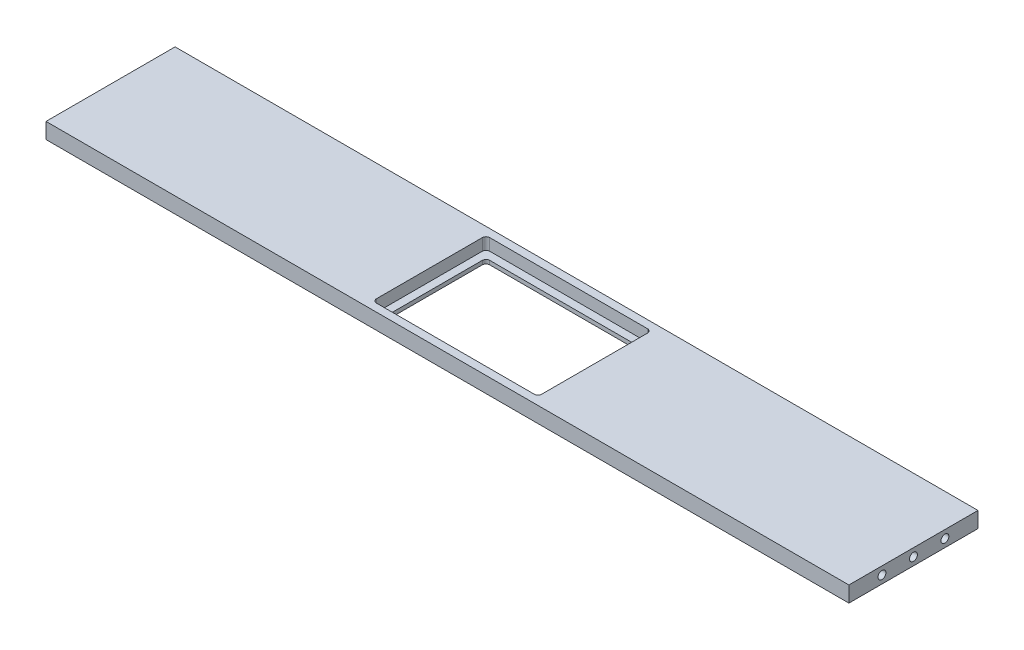
ISO-10303-21;
HEADER;
FILE_DESCRIPTION(('STEP AP214'),'2;1');
FILE_NAME('part.step','',(''),(''),'','','');
FILE_SCHEMA(('AUTOMOTIVE_DESIGN { 1 0 10303 214 1 1 1 1 }'));
ENDSEC;
DATA;
#1=APPLICATION_CONTEXT('core data for automotive mechanical design processes');
#2=APPLICATION_PROTOCOL_DEFINITION('international standard','automotive_design',2000,#1);
#3=PRODUCT_CONTEXT('',#1,'mechanical');
#4=PRODUCT('Part','Part','',(#3));
#5=PRODUCT_RELATED_PRODUCT_CATEGORY('part','',(#4));
#6=PRODUCT_DEFINITION_FORMATION('','',#4);
#7=PRODUCT_DEFINITION_CONTEXT('part definition',#1,'design');
#8=PRODUCT_DEFINITION('design','',#6,#7);
#9=PRODUCT_DEFINITION_SHAPE('','',#8);
#10=(LENGTH_UNIT() NAMED_UNIT(*) SI_UNIT(.MILLI.,.METRE.));
#11=(NAMED_UNIT(*) PLANE_ANGLE_UNIT() SI_UNIT($,.RADIAN.));
#12=(NAMED_UNIT(*) SI_UNIT($,.STERADIAN.) SOLID_ANGLE_UNIT());
#13=UNCERTAINTY_MEASURE_WITH_UNIT(LENGTH_MEASURE(1.E-05),#10,'distance_accuracy_value','');
#14=(GEOMETRIC_REPRESENTATION_CONTEXT(3) GLOBAL_UNCERTAINTY_ASSIGNED_CONTEXT((#13)) GLOBAL_UNIT_ASSIGNED_CONTEXT((#10,
#11,#12)) REPRESENTATION_CONTEXT('',''));
#15=CARTESIAN_POINT('',(0.,0.,0.));
#16=DIRECTION('',(0.,0.,1.));
#17=DIRECTION('',(1.,0.,0.));
#18=AXIS2_PLACEMENT_3D('',#15,#16,#17);
#19=CARTESIAN_POINT('',(-323.85,-12.7,52.07));
#20=DIRECTION('',(0.,1.,0.));
#21=DIRECTION('',(0.,0.,1.));
#22=AXIS2_PLACEMENT_3D('',#19,#20,#21);
#23=PLANE('',#22);
#24=DIRECTION('',(1.,0.,0.));
#25=VECTOR('',#24,1.);
#26=CARTESIAN_POINT('',(-323.85,-12.7,-52.07));
#27=LINE('',#26,#25);
#28=CARTESIAN_POINT('',(-323.85,-12.7,-52.07));
#29=VERTEX_POINT('',#28);
#30=CARTESIAN_POINT('',(323.85,-12.7,-52.07));
#31=VERTEX_POINT('',#30);
#32=EDGE_CURVE('E296',#29,#31,#27,.T.);
#33=ORIENTED_EDGE('',*,*,#32,.T.);
#34=DIRECTION('',(0.,0.,-1.));
#35=VECTOR('',#34,1.);
#36=CARTESIAN_POINT('',(323.85,-12.7,52.07));
#37=LINE('',#36,#35);
#38=CARTESIAN_POINT('',(323.85,-12.7,52.07));
#39=VERTEX_POINT('',#38);
#40=EDGE_CURVE('E365',#39,#31,#37,.T.);
#41=ORIENTED_EDGE('',*,*,#40,.F.);
#42=DIRECTION('',(1.,0.,0.));
#43=VECTOR('',#42,1.);
#44=CARTESIAN_POINT('',(-323.85,-12.7,52.07));
#45=LINE('',#44,#43);
#46=CARTESIAN_POINT('',(-323.85,-12.7,52.07));
#47=VERTEX_POINT('',#46);
#48=EDGE_CURVE('E339',#47,#39,#45,.T.);
#49=ORIENTED_EDGE('',*,*,#48,.F.);
#50=DIRECTION('',(0.,0.,-1.));
#51=VECTOR('',#50,1.);
#52=CARTESIAN_POINT('',(-323.85,-12.7,52.07));
#53=LINE('',#52,#51);
#54=EDGE_CURVE('E349',#47,#29,#53,.T.);
#55=ORIENTED_EDGE('',*,*,#54,.T.);
#56=EDGE_LOOP('',(#33,#41,#49,#55));
#57=FACE_BOUND('',#56,.T.);
#58=CARTESIAN_POINT('',(57.325,-12.7,36.37));
#59=DIRECTION('',(0.,-1.,0.));
#60=DIRECTION('',(0.,0.,-1.));
#61=AXIS2_PLACEMENT_3D('',#58,#59,#60);
#62=CIRCLE('',#61,3.);
#63=CARTESIAN_POINT('',(60.325,-12.7,36.37));
#64=VERTEX_POINT('',#63);
#65=CARTESIAN_POINT('',(57.325,-12.7,39.37));
#66=VERTEX_POINT('',#65);
#67=EDGE_CURVE('E190',#64,#66,#62,.T.);
#68=ORIENTED_EDGE('',*,*,#67,.F.);
#69=DIRECTION('',(0.,0.,1.));
#70=VECTOR('',#69,1.);
#71=CARTESIAN_POINT('',(60.325,-12.7,-36.37));
#72=LINE('',#71,#70);
#73=CARTESIAN_POINT('',(60.325,-12.7,-36.37));
#74=VERTEX_POINT('',#73);
#75=EDGE_CURVE('E223',#74,#64,#72,.T.);
#76=ORIENTED_EDGE('',*,*,#75,.F.);
#77=CARTESIAN_POINT('',(57.325,-12.7,-36.37));
#78=DIRECTION('',(0.,-1.,0.));
#79=DIRECTION('',(0.,0.,-1.));
#80=AXIS2_PLACEMENT_3D('',#77,#78,#79);
#81=CIRCLE('',#80,3.);
#82=CARTESIAN_POINT('',(57.325,-12.7,-39.37));
#83=VERTEX_POINT('',#82);
#84=EDGE_CURVE('E221',#83,#74,#81,.T.);
#85=ORIENTED_EDGE('',*,*,#84,.F.);
#86=DIRECTION('',(-1.,0.,0.));
#87=VECTOR('',#86,1.);
#88=CARTESIAN_POINT('',(57.325,-12.7,-39.37));
#89=LINE('',#88,#87);
#90=CARTESIAN_POINT('',(-57.325,-12.7,-39.37));
#91=VERTEX_POINT('',#90);
#92=EDGE_CURVE('E218',#83,#91,#89,.T.);
#93=ORIENTED_EDGE('',*,*,#92,.T.);
#94=CARTESIAN_POINT('',(-57.325,-12.7,-36.37));
#95=DIRECTION('',(0.,1.,0.));
#96=DIRECTION('',(0.,0.,1.));
#97=AXIS2_PLACEMENT_3D('',#94,#95,#96);
#98=CIRCLE('',#97,3.00000000000001);
#99=CARTESIAN_POINT('',(-60.325,-12.7,-36.37));
#100=VERTEX_POINT('',#99);
#101=EDGE_CURVE('E215',#91,#100,#98,.T.);
#102=ORIENTED_EDGE('',*,*,#101,.T.);
#103=DIRECTION('',(0.,0.,1.));
#104=VECTOR('',#103,1.);
#105=CARTESIAN_POINT('',(-60.325,-12.7,-36.37));
#106=LINE('',#105,#104);
#107=CARTESIAN_POINT('',(-60.325,-12.7,36.37));
#108=VERTEX_POINT('',#107);
#109=EDGE_CURVE('E211',#100,#108,#106,.T.);
#110=ORIENTED_EDGE('',*,*,#109,.T.);
#111=CARTESIAN_POINT('',(-57.325,-12.7,36.37));
#112=DIRECTION('',(0.,-1.,0.));
#113=DIRECTION('',(0.,0.,-1.));
#114=AXIS2_PLACEMENT_3D('',#111,#112,#113);
#115=CIRCLE('',#114,3.00000000000001);
#116=CARTESIAN_POINT('',(-57.325,-12.7,39.37));
#117=VERTEX_POINT('',#116);
#118=EDGE_CURVE('E209',#117,#108,#115,.T.);
#119=ORIENTED_EDGE('',*,*,#118,.F.);
#120=DIRECTION('',(-1.,0.,0.));
#121=VECTOR('',#120,1.);
#122=CARTESIAN_POINT('',(57.325,-12.7,39.37));
#123=LINE('',#122,#121);
#124=EDGE_CURVE('E197',#66,#117,#123,.T.);
#125=ORIENTED_EDGE('',*,*,#124,.F.);
#126=EDGE_LOOP('',(#68,#76,#85,#93,#102,#110,#119,#125));
#127=FACE_BOUND('',#126,.T.);
#128=ADVANCED_FACE('F37',(#57,#127),#23,.F.);
#129=CARTESIAN_POINT('',(-323.85,-9.52500000000004,52.07));
#130=DIRECTION('',(0.,1.,0.));
#131=DIRECTION('',(0.,0.,1.));
#132=AXIS2_PLACEMENT_3D('',#129,#130,#131);
#133=PLANE('',#132);
#134=DIRECTION('',(1.,0.,0.));
#135=VECTOR('',#134,1.);
#136=CARTESIAN_POINT('',(63.675,-9.52500000000003,45.72));
#137=LINE('',#136,#135);
#138=CARTESIAN_POINT('',(-63.675,-9.52500000000003,45.72));
#139=VERTEX_POINT('',#138);
#140=CARTESIAN_POINT('',(63.675,-9.52500000000003,45.72));
#141=VERTEX_POINT('',#140);
#142=EDGE_CURVE('E290',#139,#141,#137,.T.);
#143=ORIENTED_EDGE('',*,*,#142,.T.);
#144=CARTESIAN_POINT('',(63.675,-9.52500000000003,42.72));
#145=DIRECTION('',(0.,1.,0.));
#146=DIRECTION('',(0.,0.,1.));
#147=AXIS2_PLACEMENT_3D('',#144,#145,#146);
#148=CIRCLE('',#147,3.00000000000001);
#149=CARTESIAN_POINT('',(66.675,-9.52500000000003,42.72));
#150=VERTEX_POINT('',#149);
#151=EDGE_CURVE('E293',#141,#150,#148,.T.);
#152=ORIENTED_EDGE('',*,*,#151,.T.);
#153=DIRECTION('',(0.,0.,-1.));
#154=VECTOR('',#153,1.);
#155=CARTESIAN_POINT('',(66.675,-9.52500000000003,-42.72));
#156=LINE('',#155,#154);
#157=CARTESIAN_POINT('',(66.675,-9.52500000000003,-42.72));
#158=VERTEX_POINT('',#157);
#159=EDGE_CURVE('E280',#150,#158,#156,.T.);
#160=ORIENTED_EDGE('',*,*,#159,.T.);
#161=CARTESIAN_POINT('',(63.675,-9.52500000000003,-42.72));
#162=DIRECTION('',(0.,1.,0.));
#163=DIRECTION('',(0.,0.,1.));
#164=AXIS2_PLACEMENT_3D('',#161,#162,#163);
#165=CIRCLE('',#164,3.);
#166=CARTESIAN_POINT('',(63.675,-9.52500000000003,-45.72));
#167=VERTEX_POINT('',#166);
#168=EDGE_CURVE('E276',#158,#167,#165,.T.);
#169=ORIENTED_EDGE('',*,*,#168,.T.);
#170=DIRECTION('',(1.,0.,0.));
#171=VECTOR('',#170,1.);
#172=CARTESIAN_POINT('',(63.675,-9.52500000000003,-45.72));
#173=LINE('',#172,#171);
#174=CARTESIAN_POINT('',(-63.675,-9.52500000000003,-45.72));
#175=VERTEX_POINT('',#174);
#176=EDGE_CURVE('E279',#175,#167,#173,.T.);
#177=ORIENTED_EDGE('',*,*,#176,.F.);
#178=CARTESIAN_POINT('',(-63.675,-9.52500000000003,-42.72));
#179=DIRECTION('',(0.,1.,0.));
#180=DIRECTION('',(0.,0.,1.));
#181=AXIS2_PLACEMENT_3D('',#178,#179,#180);
#182=CIRCLE('',#181,3.);
#183=CARTESIAN_POINT('',(-66.675,-9.52500000000003,-42.72));
#184=VERTEX_POINT('',#183);
#185=EDGE_CURVE('E282',#175,#184,#182,.T.);
#186=ORIENTED_EDGE('',*,*,#185,.T.);
#187=DIRECTION('',(0.,0.,-1.));
#188=VECTOR('',#187,1.);
#189=CARTESIAN_POINT('',(-66.675,-9.52500000000003,-42.72));
#190=LINE('',#189,#188);
#191=CARTESIAN_POINT('',(-66.675,-9.52500000000003,42.72));
#192=VERTEX_POINT('',#191);
#193=EDGE_CURVE('E285',#192,#184,#190,.T.);
#194=ORIENTED_EDGE('',*,*,#193,.F.);
#195=CARTESIAN_POINT('',(-63.675,-9.52500000000003,42.72));
#196=DIRECTION('',(0.,1.,0.));
#197=DIRECTION('',(0.,0.,1.));
#198=AXIS2_PLACEMENT_3D('',#195,#196,#197);
#199=CIRCLE('',#198,3.);
#200=EDGE_CURVE('E287',#192,#139,#199,.T.);
#201=ORIENTED_EDGE('',*,*,#200,.T.);
#202=EDGE_LOOP('',(#143,#152,#160,#169,#177,#186,#194,#201));
#203=FACE_BOUND('',#202,.T.);
#204=DIRECTION('',(0.,0.,1.));
#205=VECTOR('',#204,1.);
#206=CARTESIAN_POINT('',(60.325,-9.52500000000004,52.0700000000001));
#207=LINE('',#206,#205);
#208=CARTESIAN_POINT('',(60.325,-9.52500000000004,-36.37));
#209=VERTEX_POINT('',#208);
#210=CARTESIAN_POINT('',(60.325,-9.52500000000004,36.37));
#211=VERTEX_POINT('',#210);
#212=EDGE_CURVE('E368',#209,#211,#207,.T.);
#213=ORIENTED_EDGE('',*,*,#212,.T.);
#214=CARTESIAN_POINT('',(57.325,-9.52500000000004,36.37));
#215=DIRECTION('',(0.,1.,0.));
#216=DIRECTION('',(0.,0.,1.));
#217=AXIS2_PLACEMENT_3D('',#214,#215,#216);
#218=CIRCLE('',#217,3.);
#219=CARTESIAN_POINT('',(57.325,-9.52500000000004,39.37));
#220=VERTEX_POINT('',#219);
#221=EDGE_CURVE('E12',#211,#220,#218,.F.);
#222=ORIENTED_EDGE('',*,*,#221,.T.);
#223=DIRECTION('',(-1.,0.,0.));
#224=VECTOR('',#223,1.);
#225=CARTESIAN_POINT('',(-323.85,-9.52500000000004,39.37));
#226=LINE('',#225,#224);
#227=CARTESIAN_POINT('',(-57.325,-9.52500000000004,39.37));
#228=VERTEX_POINT('',#227);
#229=EDGE_CURVE('E44',#220,#228,#226,.T.);
#230=ORIENTED_EDGE('',*,*,#229,.T.);
#231=CARTESIAN_POINT('',(-57.325,-9.52500000000004,36.37));
#232=DIRECTION('',(0.,1.,0.));
#233=DIRECTION('',(0.,0.,1.));
#234=AXIS2_PLACEMENT_3D('',#231,#232,#233);
#235=CIRCLE('',#234,3.00000000000001);
#236=CARTESIAN_POINT('',(-60.325,-9.52500000000004,36.37));
#237=VERTEX_POINT('',#236);
#238=EDGE_CURVE('E380',#228,#237,#235,.F.);
#239=ORIENTED_EDGE('',*,*,#238,.T.);
#240=DIRECTION('',(0.,0.,1.));
#241=VECTOR('',#240,1.);
#242=CARTESIAN_POINT('',(-60.325,-9.52500000000004,52.07));
#243=LINE('',#242,#241);
#244=CARTESIAN_POINT('',(-60.325,-9.52500000000004,-36.37));
#245=VERTEX_POINT('',#244);
#246=EDGE_CURVE('E378',#245,#237,#243,.T.);
#247=ORIENTED_EDGE('',*,*,#246,.F.);
#248=CARTESIAN_POINT('',(-57.325,-9.52500000000004,-36.37));
#249=DIRECTION('',(0.,1.,0.));
#250=DIRECTION('',(0.,0.,1.));
#251=AXIS2_PLACEMENT_3D('',#248,#249,#250);
#252=CIRCLE('',#251,3.00000000000001);
#253=CARTESIAN_POINT('',(-57.325,-9.52500000000004,-39.37));
#254=VERTEX_POINT('',#253);
#255=EDGE_CURVE('E376',#254,#245,#252,.T.);
#256=ORIENTED_EDGE('',*,*,#255,.F.);
#257=DIRECTION('',(-1.,0.,0.));
#258=VECTOR('',#257,1.);
#259=CARTESIAN_POINT('',(-323.85,-9.52500000000004,-39.37));
#260=LINE('',#259,#258);
#261=CARTESIAN_POINT('',(57.325,-9.52500000000004,-39.37));
#262=VERTEX_POINT('',#261);
#263=EDGE_CURVE('E374',#262,#254,#260,.T.);
#264=ORIENTED_EDGE('',*,*,#263,.F.);
#265=CARTESIAN_POINT('',(57.325,-9.52500000000004,-36.37));
#266=DIRECTION('',(0.,1.,0.));
#267=DIRECTION('',(0.,0.,1.));
#268=AXIS2_PLACEMENT_3D('',#265,#266,#267);
#269=CIRCLE('',#268,3.);
#270=EDGE_CURVE('E371',#262,#209,#269,.F.);
#271=ORIENTED_EDGE('',*,*,#270,.T.);
#272=EDGE_LOOP('',(#213,#222,#230,#239,#247,#256,#264,#271));
#273=FACE_BOUND('',#272,.T.);
#274=ADVANCED_FACE('F383',(#203,#273),#133,.T.);
#275=CARTESIAN_POINT('',(323.85,-12.7,52.07));
#276=DIRECTION('',(-1.,0.,0.));
#277=DIRECTION('',(0.,0.,1.));
#278=AXIS2_PLACEMENT_3D('',#275,#276,#277);
#279=PLANE('',#278);
#280=CARTESIAN_POINT('',(323.85,-6.35000000000002,-25.4));
#281=DIRECTION('',(1.,0.,0.));
#282=DIRECTION('',(0.,0.,-1.));
#283=AXIS2_PLACEMENT_3D('',#280,#281,#282);
#284=CIRCLE('',#283,3.17499999999999);
#285=CARTESIAN_POINT('',(323.85,-6.35000000000002,-28.575));
#286=VERTEX_POINT('',#285);
#287=EDGE_CURVE('E204',#286,#286,#284,.T.);
#288=ORIENTED_EDGE('',*,*,#287,.F.);
#289=EDGE_LOOP('',(#288));
#290=FACE_BOUND('',#289,.T.);
#291=CARTESIAN_POINT('',(323.85,-6.35000000000002,0.));
#292=DIRECTION('',(1.,0.,0.));
#293=DIRECTION('',(0.,0.,-1.));
#294=AXIS2_PLACEMENT_3D('',#291,#292,#293);
#295=CIRCLE('',#294,3.17499999999999);
#296=CARTESIAN_POINT('',(323.85,-6.35000000000002,-3.17499999999999));
#297=VERTEX_POINT('',#296);
#298=EDGE_CURVE('E245',#297,#297,#295,.T.);
#299=ORIENTED_EDGE('',*,*,#298,.F.);
#300=EDGE_LOOP('',(#299));
#301=FACE_BOUND('',#300,.T.);
#302=CARTESIAN_POINT('',(323.85,-6.35000000000002,25.4));
#303=DIRECTION('',(1.,0.,0.));
#304=DIRECTION('',(0.,0.,-1.));
#305=AXIS2_PLACEMENT_3D('',#302,#303,#304);
#306=CIRCLE('',#305,3.17499999999999);
#307=CARTESIAN_POINT('',(323.85,-6.35000000000002,22.225));
#308=VERTEX_POINT('',#307);
#309=EDGE_CURVE('E251',#308,#308,#306,.T.);
#310=ORIENTED_EDGE('',*,*,#309,.F.);
#311=EDGE_LOOP('',(#310));
#312=FACE_BOUND('',#311,.T.);
#313=DIRECTION('',(0.,1.,0.));
#314=VECTOR('',#313,1.);
#315=CARTESIAN_POINT('',(323.85,-12.7,-52.07));
#316=LINE('',#315,#314);
#317=CARTESIAN_POINT('',(323.85,0.,-52.07));
#318=VERTEX_POINT('',#317);
#319=EDGE_CURVE('E352',#31,#318,#316,.T.);
#320=ORIENTED_EDGE('',*,*,#319,.T.);
#321=DIRECTION('',(0.,0.,-1.));
#322=VECTOR('',#321,1.);
#323=CARTESIAN_POINT('',(323.85,0.,52.07));
#324=LINE('',#323,#322);
#325=CARTESIAN_POINT('',(323.85,0.,52.07));
#326=VERTEX_POINT('',#325);
#327=EDGE_CURVE('E362',#326,#318,#324,.T.);
#328=ORIENTED_EDGE('',*,*,#327,.F.);
#329=DIRECTION('',(0.,1.,0.));
#330=VECTOR('',#329,1.);
#331=CARTESIAN_POINT('',(323.85,-12.7,52.07));
#332=LINE('',#331,#330);
#333=EDGE_CURVE('E342',#39,#326,#332,.T.);
#334=ORIENTED_EDGE('',*,*,#333,.F.);
#335=ORIENTED_EDGE('',*,*,#40,.T.);
#336=EDGE_LOOP('',(#320,#328,#334,#335));
#337=FACE_BOUND('',#336,.T.);
#338=ADVANCED_FACE('F416',(#290,#301,#312,#337),#279,.F.);
#339=CARTESIAN_POINT('',(-323.85,0.,52.07));
#340=DIRECTION('',(0.,-1.,0.));
#341=DIRECTION('',(0.,0.,-1.));
#342=AXIS2_PLACEMENT_3D('',#339,#340,#341);
#343=PLANE('',#342);
#344=DIRECTION('',(0.,0.,1.));
#345=VECTOR('',#344,1.);
#346=CARTESIAN_POINT('',(66.675,0.,-42.72));
#347=LINE('',#346,#345);
#348=CARTESIAN_POINT('',(66.675,0.,-42.72));
#349=VERTEX_POINT('',#348);
#350=CARTESIAN_POINT('',(66.675,0.,42.72));
#351=VERTEX_POINT('',#350);
#352=EDGE_CURVE('E317',#349,#351,#347,.T.);
#353=ORIENTED_EDGE('',*,*,#352,.T.);
#354=CARTESIAN_POINT('',(63.675,0.,42.72));
#355=DIRECTION('',(0.,-1.,0.));
#356=DIRECTION('',(0.,0.,-1.));
#357=AXIS2_PLACEMENT_3D('',#354,#355,#356);
#358=CIRCLE('',#357,3.00000000000001);
#359=CARTESIAN_POINT('',(63.675,0.,45.72));
#360=VERTEX_POINT('',#359);
#361=EDGE_CURVE('E275',#351,#360,#358,.T.);
#362=ORIENTED_EDGE('',*,*,#361,.T.);
#363=DIRECTION('',(-1.,0.,0.));
#364=VECTOR('',#363,1.);
#365=CARTESIAN_POINT('',(63.675,0.,45.72));
#366=LINE('',#365,#364);
#367=CARTESIAN_POINT('',(-63.675,0.,45.72));
#368=VERTEX_POINT('',#367);
#369=EDGE_CURVE('E299',#360,#368,#366,.T.);
#370=ORIENTED_EDGE('',*,*,#369,.T.);
#371=CARTESIAN_POINT('',(-63.675,0.,42.72));
#372=DIRECTION('',(0.,-1.,0.));
#373=DIRECTION('',(0.,0.,-1.));
#374=AXIS2_PLACEMENT_3D('',#371,#372,#373);
#375=CIRCLE('',#374,3.);
#376=CARTESIAN_POINT('',(-66.675,0.,42.72));
#377=VERTEX_POINT('',#376);
#378=EDGE_CURVE('E302',#368,#377,#375,.T.);
#379=ORIENTED_EDGE('',*,*,#378,.T.);
#380=DIRECTION('',(0.,0.,1.));
#381=VECTOR('',#380,1.);
#382=CARTESIAN_POINT('',(-66.675,0.,-42.72));
#383=LINE('',#382,#381);
#384=CARTESIAN_POINT('',(-66.675,0.,-42.72));
#385=VERTEX_POINT('',#384);
#386=EDGE_CURVE('E305',#385,#377,#383,.T.);
#387=ORIENTED_EDGE('',*,*,#386,.F.);
#388=CARTESIAN_POINT('',(-63.675,0.,-42.72));
#389=DIRECTION('',(0.,-1.,0.));
#390=DIRECTION('',(0.,0.,-1.));
#391=AXIS2_PLACEMENT_3D('',#388,#389,#390);
#392=CIRCLE('',#391,3.);
#393=CARTESIAN_POINT('',(-63.675,0.,-45.72));
#394=VERTEX_POINT('',#393);
#395=EDGE_CURVE('E308',#385,#394,#392,.T.);
#396=ORIENTED_EDGE('',*,*,#395,.T.);
#397=DIRECTION('',(-1.,0.,0.));
#398=VECTOR('',#397,1.);
#399=CARTESIAN_POINT('',(63.675,0.,-45.72));
#400=LINE('',#399,#398);
#401=CARTESIAN_POINT('',(63.675,0.,-45.72));
#402=VERTEX_POINT('',#401);
#403=EDGE_CURVE('E311',#402,#394,#400,.T.);
#404=ORIENTED_EDGE('',*,*,#403,.F.);
#405=CARTESIAN_POINT('',(63.675,0.,-42.72));
#406=DIRECTION('',(0.,-1.,0.));
#407=DIRECTION('',(0.,0.,-1.));
#408=AXIS2_PLACEMENT_3D('',#405,#406,#407);
#409=CIRCLE('',#408,3.);
#410=EDGE_CURVE('E314',#402,#349,#409,.T.);
#411=ORIENTED_EDGE('',*,*,#410,.T.);
#412=EDGE_LOOP('',(#353,#362,#370,#379,#387,#396,#404,#411));
#413=FACE_BOUND('',#412,.T.);
#414=DIRECTION('',(-1.,0.,0.));
#415=VECTOR('',#414,1.);
#416=CARTESIAN_POINT('',(-323.85,0.,-52.07));
#417=LINE('',#416,#415);
#418=CARTESIAN_POINT('',(-323.85,0.,-52.07));
#419=VERTEX_POINT('',#418);
#420=EDGE_CURVE('E354',#318,#419,#417,.T.);
#421=ORIENTED_EDGE('',*,*,#420,.T.);
#422=DIRECTION('',(0.,0.,-1.));
#423=VECTOR('',#422,1.);
#424=CARTESIAN_POINT('',(-323.85,0.,52.07));
#425=LINE('',#424,#423);
#426=CARTESIAN_POINT('',(-323.85,0.,52.07));
#427=VERTEX_POINT('',#426);
#428=EDGE_CURVE('E359',#427,#419,#425,.T.);
#429=ORIENTED_EDGE('',*,*,#428,.F.);
#430=DIRECTION('',(-1.,0.,0.));
#431=VECTOR('',#430,1.);
#432=CARTESIAN_POINT('',(-323.85,0.,52.07));
#433=LINE('',#432,#431);
#434=EDGE_CURVE('E345',#326,#427,#433,.T.);
#435=ORIENTED_EDGE('',*,*,#434,.F.);
#436=ORIENTED_EDGE('',*,*,#327,.T.);
#437=EDGE_LOOP('',(#421,#429,#435,#436));
#438=FACE_BOUND('',#437,.T.);
#439=ADVANCED_FACE('F437',(#413,#438),#343,.F.);
#440=CARTESIAN_POINT('',(-323.85,-12.7,52.07));
#441=DIRECTION('',(1.,0.,0.));
#442=DIRECTION('',(0.,0.,-1.));
#443=AXIS2_PLACEMENT_3D('',#440,#441,#442);
#444=PLANE('',#443);
#445=CARTESIAN_POINT('',(-323.85,-6.35000000000002,-25.4));
#446=DIRECTION('',(-1.,0.,0.));
#447=DIRECTION('',(0.,0.,1.));
#448=AXIS2_PLACEMENT_3D('',#445,#446,#447);
#449=CIRCLE('',#448,3.17499999999999);
#450=CARTESIAN_POINT('',(-323.85,-6.35000000000002,-22.225));
#451=VERTEX_POINT('',#450);
#452=EDGE_CURVE('E257',#451,#451,#449,.T.);
#453=ORIENTED_EDGE('',*,*,#452,.F.);
#454=EDGE_LOOP('',(#453));
#455=FACE_BOUND('',#454,.T.);
#456=CARTESIAN_POINT('',(-323.85,-6.35000000000002,0.));
#457=DIRECTION('',(-1.,0.,0.));
#458=DIRECTION('',(0.,0.,1.));
#459=AXIS2_PLACEMENT_3D('',#456,#457,#458);
#460=CIRCLE('',#459,3.17499999999999);
#461=CARTESIAN_POINT('',(-323.85,-6.35000000000002,3.17499999999999));
#462=VERTEX_POINT('',#461);
#463=EDGE_CURVE('E263',#462,#462,#460,.T.);
#464=ORIENTED_EDGE('',*,*,#463,.F.);
#465=EDGE_LOOP('',(#464));
#466=FACE_BOUND('',#465,.T.);
#467=CARTESIAN_POINT('',(-323.85,-6.35000000000002,25.4));
#468=DIRECTION('',(-1.,0.,0.));
#469=DIRECTION('',(0.,0.,1.));
#470=AXIS2_PLACEMENT_3D('',#467,#468,#469);
#471=CIRCLE('',#470,3.17499999999999);
#472=CARTESIAN_POINT('',(-323.85,-6.35000000000002,28.575));
#473=VERTEX_POINT('',#472);
#474=EDGE_CURVE('E269',#473,#473,#471,.T.);
#475=ORIENTED_EDGE('',*,*,#474,.F.);
#476=EDGE_LOOP('',(#475));
#477=FACE_BOUND('',#476,.T.);
#478=DIRECTION('',(0.,-1.,0.));
#479=VECTOR('',#478,1.);
#480=CARTESIAN_POINT('',(-323.85,-12.7,-52.07));
#481=LINE('',#480,#479);
#482=EDGE_CURVE('E343',#419,#29,#481,.T.);
#483=ORIENTED_EDGE('',*,*,#482,.T.);
#484=ORIENTED_EDGE('',*,*,#54,.F.);
#485=DIRECTION('',(0.,-1.,0.));
#486=VECTOR('',#485,1.);
#487=CARTESIAN_POINT('',(-323.85,-12.7,52.07));
#488=LINE('',#487,#486);
#489=EDGE_CURVE('E347',#427,#47,#488,.T.);
#490=ORIENTED_EDGE('',*,*,#489,.F.);
#491=ORIENTED_EDGE('',*,*,#428,.T.);
#492=EDGE_LOOP('',(#483,#484,#490,#491));
#493=FACE_BOUND('',#492,.T.);
#494=ADVANCED_FACE('F435',(#455,#466,#477,#493),#444,.F.);
#495=CARTESIAN_POINT('',(0.,0.,52.07));
#496=DIRECTION('',(0.,0.,1.));
#497=DIRECTION('',(1.,0.,0.));
#498=AXIS2_PLACEMENT_3D('',#495,#496,#497);
#499=PLANE('',#498);
#500=ORIENTED_EDGE('',*,*,#48,.T.);
#501=ORIENTED_EDGE('',*,*,#333,.T.);
#502=ORIENTED_EDGE('',*,*,#434,.T.);
#503=ORIENTED_EDGE('',*,*,#489,.T.);
#504=EDGE_LOOP('',(#500,#501,#502,#503));
#505=FACE_BOUND('',#504,.T.);
#506=ADVANCED_FACE('F431',(#505),#499,.T.);
#507=CARTESIAN_POINT('',(0.,0.,-52.07));
#508=DIRECTION('',(0.,0.,1.));
#509=DIRECTION('',(1.,0.,0.));
#510=AXIS2_PLACEMENT_3D('',#507,#508,#509);
#511=PLANE('',#510);
#512=ORIENTED_EDGE('',*,*,#32,.F.);
#513=ORIENTED_EDGE('',*,*,#482,.F.);
#514=ORIENTED_EDGE('',*,*,#420,.F.);
#515=ORIENTED_EDGE('',*,*,#319,.F.);
#516=EDGE_LOOP('',(#512,#513,#514,#515));
#517=FACE_BOUND('',#516,.T.);
#518=ADVANCED_FACE('F425',(#517),#511,.F.);
#519=CARTESIAN_POINT('',(66.675,-174.389505225293,-42.72));
#520=DIRECTION('',(-1.,0.,0.));
#521=DIRECTION('',(0.,0.,1.));
#522=AXIS2_PLACEMENT_3D('',#519,#520,#521);
#523=PLANE('',#522);
#524=DIRECTION('',(0.,1.,0.));
#525=VECTOR('',#524,1.);
#526=CARTESIAN_POINT('',(66.675,-174.389505225293,42.72));
#527=LINE('',#526,#525);
#528=EDGE_CURVE('E320',#150,#351,#527,.T.);
#529=ORIENTED_EDGE('',*,*,#528,.T.);
#530=ORIENTED_EDGE('',*,*,#352,.F.);
#531=DIRECTION('',(0.,1.,0.));
#532=VECTOR('',#531,1.);
#533=CARTESIAN_POINT('',(66.675,-174.389505225293,-42.72));
#534=LINE('',#533,#532);
#535=EDGE_CURVE('E322',#158,#349,#534,.T.);
#536=ORIENTED_EDGE('',*,*,#535,.F.);
#537=ORIENTED_EDGE('',*,*,#159,.F.);
#538=EDGE_LOOP('',(#529,#530,#536,#537));
#539=FACE_BOUND('',#538,.T.);
#540=ADVANCED_FACE('F451',(#539),#523,.T.);
#541=CARTESIAN_POINT('',(63.675,-174.389505225293,-42.72));
#542=DIRECTION('',(0.,1.,0.));
#543=DIRECTION('',(0.,0.,1.));
#544=AXIS2_PLACEMENT_3D('',#541,#542,#543);
#545=CYLINDRICAL_SURFACE('',#544,3.);
#546=ORIENTED_EDGE('',*,*,#535,.T.);
#547=ORIENTED_EDGE('',*,*,#410,.F.);
#548=DIRECTION('',(0.,1.,0.));
#549=VECTOR('',#548,1.);
#550=CARTESIAN_POINT('',(63.675,-174.389505225293,-45.72));
#551=LINE('',#550,#549);
#552=EDGE_CURVE('E324',#167,#402,#551,.T.);
#553=ORIENTED_EDGE('',*,*,#552,.F.);
#554=ORIENTED_EDGE('',*,*,#168,.F.);
#555=EDGE_LOOP('',(#546,#547,#553,#554));
#556=FACE_BOUND('',#555,.T.);
#557=ADVANCED_FACE('F478',(#556),#545,.F.);
#558=CARTESIAN_POINT('',(63.675,-174.389505225293,-45.72));
#559=DIRECTION('',(0.,0.,-1.));
#560=DIRECTION('',(-1.,0.,0.));
#561=AXIS2_PLACEMENT_3D('',#558,#559,#560);
#562=PLANE('',#561);
#563=ORIENTED_EDGE('',*,*,#176,.T.);
#564=ORIENTED_EDGE('',*,*,#552,.T.);
#565=ORIENTED_EDGE('',*,*,#403,.T.);
#566=DIRECTION('',(0.,1.,0.));
#567=VECTOR('',#566,1.);
#568=CARTESIAN_POINT('',(-63.675,-174.389505225293,-45.72));
#569=LINE('',#568,#567);
#570=EDGE_CURVE('E326',#175,#394,#569,.T.);
#571=ORIENTED_EDGE('',*,*,#570,.F.);
#572=EDGE_LOOP('',(#563,#564,#565,#571));
#573=FACE_BOUND('',#572,.T.);
#574=ADVANCED_FACE('F474',(#573),#562,.F.);
#575=CARTESIAN_POINT('',(-63.675,-174.389505225293,-42.72));
#576=DIRECTION('',(0.,1.,0.));
#577=DIRECTION('',(0.,0.,1.));
#578=AXIS2_PLACEMENT_3D('',#575,#576,#577);
#579=CYLINDRICAL_SURFACE('',#578,3.);
#580=ORIENTED_EDGE('',*,*,#570,.T.);
#581=ORIENTED_EDGE('',*,*,#395,.F.);
#582=DIRECTION('',(0.,1.,0.));
#583=VECTOR('',#582,1.);
#584=CARTESIAN_POINT('',(-66.675,-174.389505225293,-42.72));
#585=LINE('',#584,#583);
#586=EDGE_CURVE('E328',#184,#385,#585,.T.);
#587=ORIENTED_EDGE('',*,*,#586,.F.);
#588=ORIENTED_EDGE('',*,*,#185,.F.);
#589=EDGE_LOOP('',(#580,#581,#587,#588));
#590=FACE_BOUND('',#589,.T.);
#591=ADVANCED_FACE('F470',(#590),#579,.F.);
#592=CARTESIAN_POINT('',(-66.675,-174.389505225293,-42.72));
#593=DIRECTION('',(-1.,0.,0.));
#594=DIRECTION('',(0.,0.,1.));
#595=AXIS2_PLACEMENT_3D('',#592,#593,#594);
#596=PLANE('',#595);
#597=ORIENTED_EDGE('',*,*,#193,.T.);
#598=ORIENTED_EDGE('',*,*,#586,.T.);
#599=ORIENTED_EDGE('',*,*,#386,.T.);
#600=DIRECTION('',(0.,1.,0.));
#601=VECTOR('',#600,1.);
#602=CARTESIAN_POINT('',(-66.675,-174.389505225293,42.72));
#603=LINE('',#602,#601);
#604=EDGE_CURVE('E330',#192,#377,#603,.T.);
#605=ORIENTED_EDGE('',*,*,#604,.F.);
#606=EDGE_LOOP('',(#597,#598,#599,#605));
#607=FACE_BOUND('',#606,.T.);
#608=ADVANCED_FACE('F466',(#607),#596,.F.);
#609=CARTESIAN_POINT('',(-63.675,-174.389505225293,42.72));
#610=DIRECTION('',(0.,1.,0.));
#611=DIRECTION('',(0.,0.,1.));
#612=AXIS2_PLACEMENT_3D('',#609,#610,#611);
#613=CYLINDRICAL_SURFACE('',#612,3.);
#614=ORIENTED_EDGE('',*,*,#604,.T.);
#615=ORIENTED_EDGE('',*,*,#378,.F.);
#616=DIRECTION('',(0.,1.,0.));
#617=VECTOR('',#616,1.);
#618=CARTESIAN_POINT('',(-63.675,-174.389505225293,45.72));
#619=LINE('',#618,#617);
#620=EDGE_CURVE('E332',#139,#368,#619,.T.);
#621=ORIENTED_EDGE('',*,*,#620,.F.);
#622=ORIENTED_EDGE('',*,*,#200,.F.);
#623=EDGE_LOOP('',(#614,#615,#621,#622));
#624=FACE_BOUND('',#623,.T.);
#625=ADVANCED_FACE('F462',(#624),#613,.F.);
#626=CARTESIAN_POINT('',(63.675,-174.389505225293,45.72));
#627=DIRECTION('',(0.,0.,-1.));
#628=DIRECTION('',(-1.,0.,0.));
#629=AXIS2_PLACEMENT_3D('',#626,#627,#628);
#630=PLANE('',#629);
#631=ORIENTED_EDGE('',*,*,#620,.T.);
#632=ORIENTED_EDGE('',*,*,#369,.F.);
#633=DIRECTION('',(0.,1.,0.));
#634=VECTOR('',#633,1.);
#635=CARTESIAN_POINT('',(63.675,-174.389505225293,45.72));
#636=LINE('',#635,#634);
#637=EDGE_CURVE('E334',#141,#360,#636,.T.);
#638=ORIENTED_EDGE('',*,*,#637,.F.);
#639=ORIENTED_EDGE('',*,*,#142,.F.);
#640=EDGE_LOOP('',(#631,#632,#638,#639));
#641=FACE_BOUND('',#640,.T.);
#642=ADVANCED_FACE('F458',(#641),#630,.T.);
#643=CARTESIAN_POINT('',(63.675,-174.389505225293,42.72));
#644=DIRECTION('',(0.,1.,0.));
#645=DIRECTION('',(0.,0.,1.));
#646=AXIS2_PLACEMENT_3D('',#643,#644,#645);
#647=CYLINDRICAL_SURFACE('',#646,3.00000000000001);
#648=ORIENTED_EDGE('',*,*,#637,.T.);
#649=ORIENTED_EDGE('',*,*,#361,.F.);
#650=ORIENTED_EDGE('',*,*,#528,.F.);
#651=ORIENTED_EDGE('',*,*,#151,.F.);
#652=EDGE_LOOP('',(#648,#649,#650,#651));
#653=FACE_BOUND('',#652,.T.);
#654=ADVANCED_FACE('F454',(#653),#647,.F.);
#655=CARTESIAN_POINT('',(-273.05,-6.35000000000002,25.4));
#656=DIRECTION('',(-1.,0.,0.));
#657=DIRECTION('',(0.,0.,1.));
#658=AXIS2_PLACEMENT_3D('',#655,#656,#657);
#659=CONICAL_SURFACE('',#658,3.17499999999999,1.02974425867666);
#660=CARTESIAN_POINT('',(-271.142267534587,-6.35000000000004,25.4));
#661=VERTEX_POINT('',#660);
#662=VERTEX_LOOP('',#661);
#663=FACE_BOUND('',#662,.T.);
#664=CARTESIAN_POINT('',(-273.05,-6.35000000000002,25.4));
#665=DIRECTION('',(-1.,0.,0.));
#666=DIRECTION('',(0.,0.,1.));
#667=AXIS2_PLACEMENT_3D('',#664,#665,#666);
#668=CIRCLE('',#667,3.17499999999999);
#669=CARTESIAN_POINT('',(-273.05,-6.35000000000002,28.575));
#670=VERTEX_POINT('',#669);
#671=EDGE_CURVE('E272',#670,#670,#668,.T.);
#672=ORIENTED_EDGE('',*,*,#671,.T.);
#673=EDGE_LOOP('',(#672));
#674=FACE_BOUND('',#673,.T.);
#675=ADVANCED_FACE('F457',(#663,#674),#659,.F.);
#676=CARTESIAN_POINT('',(-323.85,-6.35000000000002,25.4));
#677=DIRECTION('',(-1.,0.,0.));
#678=DIRECTION('',(0.,0.,1.));
#679=AXIS2_PLACEMENT_3D('',#676,#677,#678);
#680=CYLINDRICAL_SURFACE('',#679,3.17499999999999);
#681=ORIENTED_EDGE('',*,*,#671,.F.);
#682=EDGE_LOOP('',(#681));
#683=FACE_BOUND('',#682,.T.);
#684=ORIENTED_EDGE('',*,*,#474,.T.);
#685=EDGE_LOOP('',(#684));
#686=FACE_BOUND('',#685,.T.);
#687=ADVANCED_FACE('F488',(#683,#686),#680,.F.);
#688=CARTESIAN_POINT('',(-273.05,-6.35000000000002,0.));
#689=DIRECTION('',(-1.,0.,0.));
#690=DIRECTION('',(0.,0.,1.));
#691=AXIS2_PLACEMENT_3D('',#688,#689,#690);
#692=CONICAL_SURFACE('',#691,3.17499999999999,1.02974425867666);
#693=CARTESIAN_POINT('',(-271.142267534587,-6.35000000000004,0.));
#694=VERTEX_POINT('',#693);
#695=VERTEX_LOOP('',#694);
#696=FACE_BOUND('',#695,.T.);
#697=CARTESIAN_POINT('',(-273.05,-6.35000000000002,0.));
#698=DIRECTION('',(-1.,0.,0.));
#699=DIRECTION('',(0.,0.,1.));
#700=AXIS2_PLACEMENT_3D('',#697,#698,#699);
#701=CIRCLE('',#700,3.17499999999999);
#702=CARTESIAN_POINT('',(-273.05,-6.35000000000002,3.17499999999999));
#703=VERTEX_POINT('',#702);
#704=EDGE_CURVE('E266',#703,#703,#701,.T.);
#705=ORIENTED_EDGE('',*,*,#704,.T.);
#706=EDGE_LOOP('',(#705));
#707=FACE_BOUND('',#706,.T.);
#708=ADVANCED_FACE('F492',(#696,#707),#692,.F.);
#709=CARTESIAN_POINT('',(-323.85,-6.35000000000002,0.));
#710=DIRECTION('',(-1.,0.,0.));
#711=DIRECTION('',(0.,0.,1.));
#712=AXIS2_PLACEMENT_3D('',#709,#710,#711);
#713=CYLINDRICAL_SURFACE('',#712,3.17499999999999);
#714=ORIENTED_EDGE('',*,*,#704,.F.);
#715=EDGE_LOOP('',(#714));
#716=FACE_BOUND('',#715,.T.);
#717=ORIENTED_EDGE('',*,*,#463,.T.);
#718=EDGE_LOOP('',(#717));
#719=FACE_BOUND('',#718,.T.);
#720=ADVANCED_FACE('F496',(#716,#719),#713,.F.);
#721=CARTESIAN_POINT('',(-273.05,-6.35000000000002,-25.4));
#722=DIRECTION('',(-1.,0.,0.));
#723=DIRECTION('',(0.,0.,1.));
#724=AXIS2_PLACEMENT_3D('',#721,#722,#723);
#725=CONICAL_SURFACE('',#724,3.17499999999999,1.02974425867666);
#726=CARTESIAN_POINT('',(-271.142267534587,-6.35000000000004,-25.4));
#727=VERTEX_POINT('',#726);
#728=VERTEX_LOOP('',#727);
#729=FACE_BOUND('',#728,.T.);
#730=CARTESIAN_POINT('',(-273.05,-6.35000000000002,-25.4));
#731=DIRECTION('',(-1.,0.,0.));
#732=DIRECTION('',(0.,0.,1.));
#733=AXIS2_PLACEMENT_3D('',#730,#731,#732);
#734=CIRCLE('',#733,3.17499999999999);
#735=CARTESIAN_POINT('',(-273.05,-6.35000000000002,-22.225));
#736=VERTEX_POINT('',#735);
#737=EDGE_CURVE('E260',#736,#736,#734,.T.);
#738=ORIENTED_EDGE('',*,*,#737,.T.);
#739=EDGE_LOOP('',(#738));
#740=FACE_BOUND('',#739,.T.);
#741=ADVANCED_FACE('F500',(#729,#740),#725,.F.);
#742=CARTESIAN_POINT('',(-323.85,-6.35000000000002,-25.4));
#743=DIRECTION('',(-1.,0.,0.));
#744=DIRECTION('',(0.,0.,1.));
#745=AXIS2_PLACEMENT_3D('',#742,#743,#744);
#746=CYLINDRICAL_SURFACE('',#745,3.17499999999999);
#747=ORIENTED_EDGE('',*,*,#737,.F.);
#748=EDGE_LOOP('',(#747));
#749=FACE_BOUND('',#748,.T.);
#750=ORIENTED_EDGE('',*,*,#452,.T.);
#751=EDGE_LOOP('',(#750));
#752=FACE_BOUND('',#751,.T.);
#753=ADVANCED_FACE('F504',(#749,#752),#746,.F.);
#754=CARTESIAN_POINT('',(273.05,-6.35000000000002,25.4));
#755=DIRECTION('',(1.,0.,0.));
#756=DIRECTION('',(0.,0.,-1.));
#757=AXIS2_PLACEMENT_3D('',#754,#755,#756);
#758=CONICAL_SURFACE('',#757,3.17499999999999,1.02974425867666);
#759=CARTESIAN_POINT('',(271.142267534587,-6.35000000000004,25.4));
#760=VERTEX_POINT('',#759);
#761=VERTEX_LOOP('',#760);
#762=FACE_BOUND('',#761,.T.);
#763=CARTESIAN_POINT('',(273.05,-6.35000000000002,25.4));
#764=DIRECTION('',(1.,0.,0.));
#765=DIRECTION('',(0.,0.,-1.));
#766=AXIS2_PLACEMENT_3D('',#763,#764,#765);
#767=CIRCLE('',#766,3.17499999999999);
#768=CARTESIAN_POINT('',(273.05,-6.35000000000002,22.225));
#769=VERTEX_POINT('',#768);
#770=EDGE_CURVE('E254',#769,#769,#767,.T.);
#771=ORIENTED_EDGE('',*,*,#770,.T.);
#772=EDGE_LOOP('',(#771));
#773=FACE_BOUND('',#772,.T.);
#774=ADVANCED_FACE('F508',(#762,#773),#758,.F.);
#775=CARTESIAN_POINT('',(323.85,-6.35000000000002,25.4));
#776=DIRECTION('',(1.,0.,0.));
#777=DIRECTION('',(0.,0.,-1.));
#778=AXIS2_PLACEMENT_3D('',#775,#776,#777);
#779=CYLINDRICAL_SURFACE('',#778,3.17499999999999);
#780=ORIENTED_EDGE('',*,*,#770,.F.);
#781=EDGE_LOOP('',(#780));
#782=FACE_BOUND('',#781,.T.);
#783=ORIENTED_EDGE('',*,*,#309,.T.);
#784=EDGE_LOOP('',(#783));
#785=FACE_BOUND('',#784,.T.);
#786=ADVANCED_FACE('F512',(#782,#785),#779,.F.);
#787=CARTESIAN_POINT('',(273.05,-6.35000000000002,0.));
#788=DIRECTION('',(1.,0.,0.));
#789=DIRECTION('',(0.,0.,-1.));
#790=AXIS2_PLACEMENT_3D('',#787,#788,#789);
#791=CONICAL_SURFACE('',#790,3.17499999999999,1.02974425867666);
#792=CARTESIAN_POINT('',(271.142267534587,-6.35000000000004,0.));
#793=VERTEX_POINT('',#792);
#794=VERTEX_LOOP('',#793);
#795=FACE_BOUND('',#794,.T.);
#796=CARTESIAN_POINT('',(273.05,-6.35000000000002,0.));
#797=DIRECTION('',(1.,0.,0.));
#798=DIRECTION('',(0.,0.,-1.));
#799=AXIS2_PLACEMENT_3D('',#796,#797,#798);
#800=CIRCLE('',#799,3.17499999999999);
#801=CARTESIAN_POINT('',(273.05,-6.35000000000002,-3.17499999999999));
#802=VERTEX_POINT('',#801);
#803=EDGE_CURVE('E248',#802,#802,#800,.T.);
#804=ORIENTED_EDGE('',*,*,#803,.T.);
#805=EDGE_LOOP('',(#804));
#806=FACE_BOUND('',#805,.T.);
#807=ADVANCED_FACE('F516',(#795,#806),#791,.F.);
#808=CARTESIAN_POINT('',(323.85,-6.35000000000002,0.));
#809=DIRECTION('',(1.,0.,0.));
#810=DIRECTION('',(0.,0.,-1.));
#811=AXIS2_PLACEMENT_3D('',#808,#809,#810);
#812=CYLINDRICAL_SURFACE('',#811,3.17499999999999);
#813=ORIENTED_EDGE('',*,*,#803,.F.);
#814=EDGE_LOOP('',(#813));
#815=FACE_BOUND('',#814,.T.);
#816=ORIENTED_EDGE('',*,*,#298,.T.);
#817=EDGE_LOOP('',(#816));
#818=FACE_BOUND('',#817,.T.);
#819=ADVANCED_FACE('F520',(#815,#818),#812,.F.);
#820=CARTESIAN_POINT('',(273.05,-6.35000000000002,-25.4));
#821=DIRECTION('',(1.,0.,0.));
#822=DIRECTION('',(0.,0.,-1.));
#823=AXIS2_PLACEMENT_3D('',#820,#821,#822);
#824=CONICAL_SURFACE('',#823,3.17499999999999,1.02974425867666);
#825=CARTESIAN_POINT('',(271.142267534587,-6.35000000000004,-25.4));
#826=VERTEX_POINT('',#825);
#827=VERTEX_LOOP('',#826);
#828=FACE_BOUND('',#827,.T.);
#829=CARTESIAN_POINT('',(273.05,-6.35000000000002,-25.4));
#830=DIRECTION('',(1.,0.,0.));
#831=DIRECTION('',(0.,0.,-1.));
#832=AXIS2_PLACEMENT_3D('',#829,#830,#831);
#833=CIRCLE('',#832,3.17499999999999);
#834=CARTESIAN_POINT('',(273.05,-6.35000000000002,-28.575));
#835=VERTEX_POINT('',#834);
#836=EDGE_CURVE('E242',#835,#835,#833,.T.);
#837=ORIENTED_EDGE('',*,*,#836,.T.);
#838=EDGE_LOOP('',(#837));
#839=FACE_BOUND('',#838,.T.);
#840=ADVANCED_FACE('F524',(#828,#839),#824,.F.);
#841=CARTESIAN_POINT('',(323.85,-6.35000000000002,-25.4));
#842=DIRECTION('',(1.,0.,0.));
#843=DIRECTION('',(0.,0.,-1.));
#844=AXIS2_PLACEMENT_3D('',#841,#842,#843);
#845=CYLINDRICAL_SURFACE('',#844,3.17499999999999);
#846=ORIENTED_EDGE('',*,*,#836,.F.);
#847=EDGE_LOOP('',(#846));
#848=FACE_BOUND('',#847,.T.);
#849=ORIENTED_EDGE('',*,*,#287,.T.);
#850=EDGE_LOOP('',(#849));
#851=FACE_BOUND('',#850,.T.);
#852=ADVANCED_FACE('F528',(#848,#851),#845,.F.);
#853=CARTESIAN_POINT('',(57.325,-12.7,36.37));
#854=DIRECTION('',(0.,1.,0.));
#855=DIRECTION('',(0.,0.,1.));
#856=AXIS2_PLACEMENT_3D('',#853,#854,#855);
#857=CYLINDRICAL_SURFACE('',#856,3.);
#858=DIRECTION('',(0.,1.,0.));
#859=VECTOR('',#858,1.);
#860=CARTESIAN_POINT('',(60.325,-12.7,36.37));
#861=LINE('',#860,#859);
#862=EDGE_CURVE('E56',#64,#211,#861,.T.);
#863=ORIENTED_EDGE('',*,*,#862,.F.);
#864=ORIENTED_EDGE('',*,*,#67,.T.);
#865=DIRECTION('',(0.,1.,0.));
#866=VECTOR('',#865,1.);
#867=CARTESIAN_POINT('',(57.325,-12.7,39.37));
#868=LINE('',#867,#866);
#869=EDGE_CURVE('E193',#66,#220,#868,.T.);
#870=ORIENTED_EDGE('',*,*,#869,.T.);
#871=ORIENTED_EDGE('',*,*,#221,.F.);
#872=EDGE_LOOP('',(#863,#864,#870,#871));
#873=FACE_BOUND('',#872,.T.);
#874=ADVANCED_FACE('F192',(#873),#857,.F.);
#875=CARTESIAN_POINT('',(57.325,-12.7,39.37));
#876=DIRECTION('',(0.,0.,-1.));
#877=DIRECTION('',(-1.,0.,0.));
#878=AXIS2_PLACEMENT_3D('',#875,#876,#877);
#879=PLANE('',#878);
#880=ORIENTED_EDGE('',*,*,#869,.F.);
#881=ORIENTED_EDGE('',*,*,#124,.T.);
#882=DIRECTION('',(0.,1.,0.));
#883=VECTOR('',#882,1.);
#884=CARTESIAN_POINT('',(-57.325,-12.7,39.37));
#885=LINE('',#884,#883);
#886=EDGE_CURVE('E205',#117,#228,#885,.T.);
#887=ORIENTED_EDGE('',*,*,#886,.T.);
#888=ORIENTED_EDGE('',*,*,#229,.F.);
#889=EDGE_LOOP('',(#880,#881,#887,#888));
#890=FACE_BOUND('',#889,.T.);
#891=ADVANCED_FACE('F200',(#890),#879,.T.);
#892=CARTESIAN_POINT('',(-57.325,-12.7,36.37));
#893=DIRECTION('',(0.,1.,0.));
#894=DIRECTION('',(0.,0.,1.));
#895=AXIS2_PLACEMENT_3D('',#892,#893,#894);
#896=CYLINDRICAL_SURFACE('',#895,3.00000000000001);
#897=ORIENTED_EDGE('',*,*,#886,.F.);
#898=ORIENTED_EDGE('',*,*,#118,.T.);
#899=DIRECTION('',(0.,1.,0.));
#900=VECTOR('',#899,1.);
#901=CARTESIAN_POINT('',(-60.325,-12.7,36.37));
#902=LINE('',#901,#900);
#903=EDGE_CURVE('E236',#108,#237,#902,.T.);
#904=ORIENTED_EDGE('',*,*,#903,.T.);
#905=ORIENTED_EDGE('',*,*,#238,.F.);
#906=EDGE_LOOP('',(#897,#898,#904,#905));
#907=FACE_BOUND('',#906,.T.);
#908=ADVANCED_FACE('F402',(#907),#896,.F.);
#909=CARTESIAN_POINT('',(-60.325,-12.7,-36.37));
#910=DIRECTION('',(-1.,0.,0.));
#911=DIRECTION('',(0.,0.,1.));
#912=AXIS2_PLACEMENT_3D('',#909,#910,#911);
#913=PLANE('',#912);
#914=ORIENTED_EDGE('',*,*,#246,.T.);
#915=ORIENTED_EDGE('',*,*,#903,.F.);
#916=ORIENTED_EDGE('',*,*,#109,.F.);
#917=DIRECTION('',(0.,1.,0.));
#918=VECTOR('',#917,1.);
#919=CARTESIAN_POINT('',(-60.325,-12.7,-36.37));
#920=LINE('',#919,#918);
#921=EDGE_CURVE('E233',#100,#245,#920,.T.);
#922=ORIENTED_EDGE('',*,*,#921,.T.);
#923=EDGE_LOOP('',(#914,#915,#916,#922));
#924=FACE_BOUND('',#923,.T.);
#925=ADVANCED_FACE('F400',(#924),#913,.F.);
#926=CARTESIAN_POINT('',(-57.325,-12.7,-36.37));
#927=DIRECTION('',(0.,1.,0.));
#928=DIRECTION('',(0.,0.,1.));
#929=AXIS2_PLACEMENT_3D('',#926,#927,#928);
#930=CYLINDRICAL_SURFACE('',#929,3.00000000000001);
#931=ORIENTED_EDGE('',*,*,#255,.T.);
#932=ORIENTED_EDGE('',*,*,#921,.F.);
#933=ORIENTED_EDGE('',*,*,#101,.F.);
#934=DIRECTION('',(0.,1.,0.));
#935=VECTOR('',#934,1.);
#936=CARTESIAN_POINT('',(-57.325,-12.7,-39.37));
#937=LINE('',#936,#935);
#938=EDGE_CURVE('E230',#91,#254,#937,.T.);
#939=ORIENTED_EDGE('',*,*,#938,.T.);
#940=EDGE_LOOP('',(#931,#932,#933,#939));
#941=FACE_BOUND('',#940,.T.);
#942=ADVANCED_FACE('F396',(#941),#930,.F.);
#943=CARTESIAN_POINT('',(57.325,-12.7,-39.37));
#944=DIRECTION('',(0.,0.,-1.));
#945=DIRECTION('',(-1.,0.,0.));
#946=AXIS2_PLACEMENT_3D('',#943,#944,#945);
#947=PLANE('',#946);
#948=ORIENTED_EDGE('',*,*,#263,.T.);
#949=ORIENTED_EDGE('',*,*,#938,.F.);
#950=ORIENTED_EDGE('',*,*,#92,.F.);
#951=DIRECTION('',(0.,1.,0.));
#952=VECTOR('',#951,1.);
#953=CARTESIAN_POINT('',(57.325,-12.7,-39.37));
#954=LINE('',#953,#952);
#955=EDGE_CURVE('E227',#83,#262,#954,.T.);
#956=ORIENTED_EDGE('',*,*,#955,.T.);
#957=EDGE_LOOP('',(#948,#949,#950,#956));
#958=FACE_BOUND('',#957,.T.);
#959=ADVANCED_FACE('F393',(#958),#947,.F.);
#960=CARTESIAN_POINT('',(57.325,-12.7,-36.37));
#961=DIRECTION('',(0.,1.,0.));
#962=DIRECTION('',(0.,0.,1.));
#963=AXIS2_PLACEMENT_3D('',#960,#961,#962);
#964=CYLINDRICAL_SURFACE('',#963,3.);
#965=ORIENTED_EDGE('',*,*,#955,.F.);
#966=ORIENTED_EDGE('',*,*,#84,.T.);
#967=DIRECTION('',(0.,1.,0.));
#968=VECTOR('',#967,1.);
#969=CARTESIAN_POINT('',(60.325,-12.7,-36.37));
#970=LINE('',#969,#968);
#971=EDGE_CURVE('E51',#74,#209,#970,.T.);
#972=ORIENTED_EDGE('',*,*,#971,.T.);
#973=ORIENTED_EDGE('',*,*,#270,.F.);
#974=EDGE_LOOP('',(#965,#966,#972,#973));
#975=FACE_BOUND('',#974,.T.);
#976=ADVANCED_FACE('F388',(#975),#964,.F.);
#977=CARTESIAN_POINT('',(60.325,-12.7,-36.37));
#978=DIRECTION('',(-1.,0.,0.));
#979=DIRECTION('',(0.,0.,1.));
#980=AXIS2_PLACEMENT_3D('',#977,#978,#979);
#981=PLANE('',#980);
#982=ORIENTED_EDGE('',*,*,#971,.F.);
#983=ORIENTED_EDGE('',*,*,#75,.T.);
#984=ORIENTED_EDGE('',*,*,#862,.T.);
#985=ORIENTED_EDGE('',*,*,#212,.F.);
#986=EDGE_LOOP('',(#982,#983,#984,#985));
#987=FACE_BOUND('',#986,.T.);
#988=ADVANCED_FACE('F386',(#987),#981,.T.);
#989=CLOSED_SHELL('',(#128,#274,#338,#439,#494,#506,#518,#540,#557,#574,#591,#608,#625,#642,
#654,#675,#687,#708,#720,#741,#753,#774,#786,#807,#819,#840,#852,#874,#891,#908,#925,#942,#959,
#976,#988));
#990=MANIFOLD_SOLID_BREP('B2',#989);
#991=ADVANCED_BREP_SHAPE_REPRESENTATION('',(#18,#990),#14);
#992=SHAPE_DEFINITION_REPRESENTATION(#9,#991);
ENDSEC;
END-ISO-10303-21;
